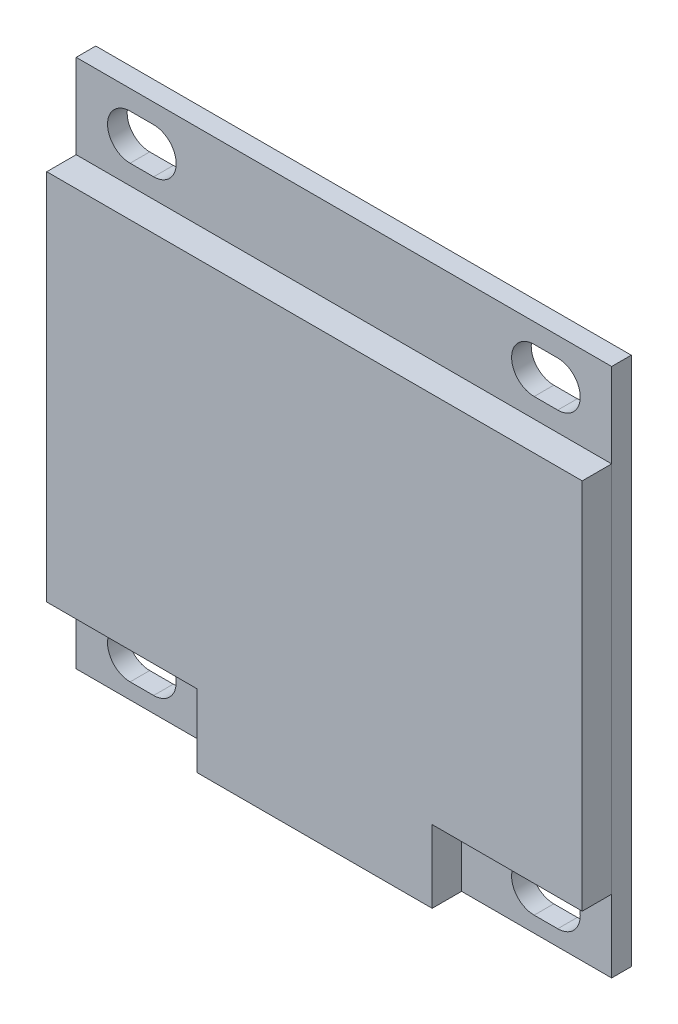
ISO-10303-21;
HEADER;
FILE_DESCRIPTION(('STEP AP214'),'2;1');
FILE_NAME('part.step','',(''),(''),'','','');
FILE_SCHEMA(('AUTOMOTIVE_DESIGN { 1 0 10303 214 1 1 1 1 }'));
ENDSEC;
DATA;
#1=APPLICATION_CONTEXT('core data for automotive mechanical design processes');
#2=APPLICATION_PROTOCOL_DEFINITION('international standard','automotive_design',2000,#1);
#3=PRODUCT_CONTEXT('',#1,'mechanical');
#4=PRODUCT('Part','Part','',(#3));
#5=PRODUCT_RELATED_PRODUCT_CATEGORY('part','',(#4));
#6=PRODUCT_DEFINITION_FORMATION('','',#4);
#7=PRODUCT_DEFINITION_CONTEXT('part definition',#1,'design');
#8=PRODUCT_DEFINITION('design','',#6,#7);
#9=PRODUCT_DEFINITION_SHAPE('','',#8);
#10=(LENGTH_UNIT() NAMED_UNIT(*) SI_UNIT(.MILLI.,.METRE.));
#11=(NAMED_UNIT(*) PLANE_ANGLE_UNIT() SI_UNIT($,.RADIAN.));
#12=(NAMED_UNIT(*) SI_UNIT($,.STERADIAN.) SOLID_ANGLE_UNIT());
#13=UNCERTAINTY_MEASURE_WITH_UNIT(LENGTH_MEASURE(1.E-05),#10,'distance_accuracy_value','');
#14=(GEOMETRIC_REPRESENTATION_CONTEXT(3) GLOBAL_UNCERTAINTY_ASSIGNED_CONTEXT((#13)) GLOBAL_UNIT_ASSIGNED_CONTEXT((#10,
#11,#12)) REPRESENTATION_CONTEXT('',''));
#15=CARTESIAN_POINT('',(0.,0.,0.));
#16=DIRECTION('',(0.,0.,1.));
#17=DIRECTION('',(1.,0.,0.));
#18=AXIS2_PLACEMENT_3D('',#15,#16,#17);
#19=CARTESIAN_POINT('',(-13.65,-9.8,2.5));
#20=DIRECTION('',(1.,0.,0.));
#21=DIRECTION('',(0.,0.,-1.));
#22=AXIS2_PLACEMENT_3D('',#19,#20,#21);
#23=PLANE('',#22);
#24=DIRECTION('',(0.,-1.,0.));
#25=VECTOR('',#24,1.);
#26=CARTESIAN_POINT('',(-13.65,-9.8,1.));
#27=LINE('',#26,#25);
#28=CARTESIAN_POINT('',(-13.65,9.19999999999999,1.));
#29=VERTEX_POINT('',#28);
#30=CARTESIAN_POINT('',(-13.65,-9.8,1.));
#31=VERTEX_POINT('',#30);
#32=EDGE_CURVE('E141',#29,#31,#27,.T.);
#33=ORIENTED_EDGE('',*,*,#32,.T.);
#34=DIRECTION('',(0.,0.,-1.));
#35=VECTOR('',#34,1.);
#36=CARTESIAN_POINT('',(-13.65,-9.8,2.5));
#37=LINE('',#36,#35);
#38=CARTESIAN_POINT('',(-13.65,-9.8,2.5));
#39=VERTEX_POINT('',#38);
#40=EDGE_CURVE('E12',#39,#31,#37,.T.);
#41=ORIENTED_EDGE('',*,*,#40,.F.);
#42=DIRECTION('',(0.,-1.,0.));
#43=VECTOR('',#42,1.);
#44=CARTESIAN_POINT('',(-13.65,-9.8,2.5));
#45=LINE('',#44,#43);
#46=CARTESIAN_POINT('',(-13.65,9.19999999999999,2.5));
#47=VERTEX_POINT('',#46);
#48=EDGE_CURVE('E155',#47,#39,#45,.T.);
#49=ORIENTED_EDGE('',*,*,#48,.F.);
#50=DIRECTION('',(0.,0.,-1.));
#51=VECTOR('',#50,1.);
#52=CARTESIAN_POINT('',(-13.65,9.19999999999999,2.5));
#53=LINE('',#52,#51);
#54=EDGE_CURVE('E137',#47,#29,#53,.T.);
#55=ORIENTED_EDGE('',*,*,#54,.T.);
#56=EDGE_LOOP('',(#33,#41,#49,#55));
#57=FACE_BOUND('',#56,.T.);
#58=ADVANCED_FACE('F45',(#57),#23,.F.);
#59=CARTESIAN_POINT('',(-13.65,-9.8,2.5));
#60=DIRECTION('',(0.,1.,0.));
#61=DIRECTION('',(-1.,0.,0.));
#62=AXIS2_PLACEMENT_3D('',#59,#60,#61);
#63=PLANE('',#62);
#64=DIRECTION('',(1.,0.,0.));
#65=VECTOR('',#64,1.);
#66=CARTESIAN_POINT('',(-13.65,-9.8,1.));
#67=LINE('',#66,#65);
#68=CARTESIAN_POINT('',(-6.,-9.8,1.));
#69=VERTEX_POINT('',#68);
#70=EDGE_CURVE('E144',#31,#69,#67,.T.);
#71=ORIENTED_EDGE('',*,*,#70,.T.);
#72=DIRECTION('',(0.,0.,-1.));
#73=VECTOR('',#72,1.);
#74=CARTESIAN_POINT('',(-6.,-9.8,2.5));
#75=LINE('',#74,#73);
#76=CARTESIAN_POINT('',(-6.,-9.8,2.5));
#77=VERTEX_POINT('',#76);
#78=EDGE_CURVE('E53',#77,#69,#75,.T.);
#79=ORIENTED_EDGE('',*,*,#78,.F.);
#80=DIRECTION('',(1.,0.,0.));
#81=VECTOR('',#80,1.);
#82=CARTESIAN_POINT('',(-13.65,-9.8,2.5));
#83=LINE('',#82,#81);
#84=EDGE_CURVE('E104',#39,#77,#83,.T.);
#85=ORIENTED_EDGE('',*,*,#84,.F.);
#86=ORIENTED_EDGE('',*,*,#40,.T.);
#87=EDGE_LOOP('',(#71,#79,#85,#86));
#88=FACE_BOUND('',#87,.T.);
#89=ADVANCED_FACE('F190',(#88),#63,.F.);
#90=CARTESIAN_POINT('',(-6.,-9.8,2.5));
#91=DIRECTION('',(1.,0.,0.));
#92=DIRECTION('',(0.,0.,-1.));
#93=AXIS2_PLACEMENT_3D('',#90,#91,#92);
#94=PLANE('',#93);
#95=DIRECTION('',(0.,-1.,0.));
#96=VECTOR('',#95,1.);
#97=CARTESIAN_POINT('',(-6.,-9.8,1.));
#98=LINE('',#97,#96);
#99=CARTESIAN_POINT('',(-6.,-13.5,1.));
#100=VERTEX_POINT('',#99);
#101=EDGE_CURVE('E146',#69,#100,#98,.T.);
#102=ORIENTED_EDGE('',*,*,#101,.T.);
#103=DIRECTION('',(0.,0.,-1.));
#104=VECTOR('',#103,1.);
#105=CARTESIAN_POINT('',(-6.,-13.5,2.5));
#106=LINE('',#105,#104);
#107=CARTESIAN_POINT('',(-6.,-13.5,2.5));
#108=VERTEX_POINT('',#107);
#109=EDGE_CURVE('E162',#108,#100,#106,.T.);
#110=ORIENTED_EDGE('',*,*,#109,.F.);
#111=DIRECTION('',(0.,-1.,0.));
#112=VECTOR('',#111,1.);
#113=CARTESIAN_POINT('',(-6.,-9.8,2.5));
#114=LINE('',#113,#112);
#115=EDGE_CURVE('E170',#77,#108,#114,.T.);
#116=ORIENTED_EDGE('',*,*,#115,.F.);
#117=ORIENTED_EDGE('',*,*,#78,.T.);
#118=EDGE_LOOP('',(#102,#110,#116,#117));
#119=FACE_BOUND('',#118,.T.);
#120=ADVANCED_FACE('F168',(#119),#94,.F.);
#121=CARTESIAN_POINT('',(-6.,-13.5,2.5));
#122=DIRECTION('',(0.,1.,0.));
#123=DIRECTION('',(0.,0.,1.));
#124=AXIS2_PLACEMENT_3D('',#121,#122,#123);
#125=PLANE('',#124);
#126=DIRECTION('',(1.,0.,0.));
#127=VECTOR('',#126,1.);
#128=CARTESIAN_POINT('',(-6.,-13.5,1.));
#129=LINE('',#128,#127);
#130=CARTESIAN_POINT('',(6.,-13.5,1.));
#131=VERTEX_POINT('',#130);
#132=EDGE_CURVE('E148',#100,#131,#129,.T.);
#133=ORIENTED_EDGE('',*,*,#132,.T.);
#134=DIRECTION('',(0.,0.,-1.));
#135=VECTOR('',#134,1.);
#136=CARTESIAN_POINT('',(6.,-13.5,2.5));
#137=LINE('',#136,#135);
#138=CARTESIAN_POINT('',(6.,-13.5,2.5));
#139=VERTEX_POINT('',#138);
#140=EDGE_CURVE('E159',#139,#131,#137,.T.);
#141=ORIENTED_EDGE('',*,*,#140,.F.);
#142=DIRECTION('',(1.,0.,0.));
#143=VECTOR('',#142,1.);
#144=CARTESIAN_POINT('',(-6.,-13.5,2.5));
#145=LINE('',#144,#143);
#146=EDGE_CURVE('E182',#108,#139,#145,.T.);
#147=ORIENTED_EDGE('',*,*,#146,.F.);
#148=ORIENTED_EDGE('',*,*,#109,.T.);
#149=EDGE_LOOP('',(#133,#141,#147,#148));
#150=FACE_BOUND('',#149,.T.);
#151=ADVANCED_FACE('F178',(#150),#125,.F.);
#152=CARTESIAN_POINT('',(6.,-13.5,2.5));
#153=DIRECTION('',(-1.,0.,0.));
#154=DIRECTION('',(0.,0.,1.));
#155=AXIS2_PLACEMENT_3D('',#152,#153,#154);
#156=PLANE('',#155);
#157=DIRECTION('',(0.,1.,0.));
#158=VECTOR('',#157,1.);
#159=CARTESIAN_POINT('',(6.,-13.5,1.));
#160=LINE('',#159,#158);
#161=CARTESIAN_POINT('',(6.,-9.8,1.));
#162=VERTEX_POINT('',#161);
#163=EDGE_CURVE('E150',#131,#162,#160,.T.);
#164=ORIENTED_EDGE('',*,*,#163,.T.);
#165=DIRECTION('',(0.,0.,-1.));
#166=VECTOR('',#165,1.);
#167=CARTESIAN_POINT('',(6.,-9.8,2.5));
#168=LINE('',#167,#166);
#169=CARTESIAN_POINT('',(6.,-9.8,2.5));
#170=VERTEX_POINT('',#169);
#171=EDGE_CURVE('E132',#170,#162,#168,.T.);
#172=ORIENTED_EDGE('',*,*,#171,.F.);
#173=DIRECTION('',(0.,1.,0.));
#174=VECTOR('',#173,1.);
#175=CARTESIAN_POINT('',(6.,-13.5,2.5));
#176=LINE('',#175,#174);
#177=EDGE_CURVE('E123',#139,#170,#176,.T.);
#178=ORIENTED_EDGE('',*,*,#177,.F.);
#179=ORIENTED_EDGE('',*,*,#140,.T.);
#180=EDGE_LOOP('',(#164,#172,#178,#179));
#181=FACE_BOUND('',#180,.T.);
#182=ADVANCED_FACE('F181',(#181),#156,.F.);
#183=CARTESIAN_POINT('',(6.,-9.8,2.5));
#184=DIRECTION('',(0.,1.,0.));
#185=DIRECTION('',(0.,0.,1.));
#186=AXIS2_PLACEMENT_3D('',#183,#184,#185);
#187=PLANE('',#186);
#188=DIRECTION('',(1.,0.,0.));
#189=VECTOR('',#188,1.);
#190=CARTESIAN_POINT('',(6.,-9.8,1.));
#191=LINE('',#190,#189);
#192=CARTESIAN_POINT('',(13.65,-9.8,1.));
#193=VERTEX_POINT('',#192);
#194=EDGE_CURVE('E131',#162,#193,#191,.T.);
#195=ORIENTED_EDGE('',*,*,#194,.T.);
#196=DIRECTION('',(0.,0.,-1.));
#197=VECTOR('',#196,1.);
#198=CARTESIAN_POINT('',(13.65,-9.8,2.5));
#199=LINE('',#198,#197);
#200=CARTESIAN_POINT('',(13.65,-9.8,2.5));
#201=VERTEX_POINT('',#200);
#202=EDGE_CURVE('E128',#201,#193,#199,.T.);
#203=ORIENTED_EDGE('',*,*,#202,.F.);
#204=DIRECTION('',(1.,0.,0.));
#205=VECTOR('',#204,1.);
#206=CARTESIAN_POINT('',(6.,-9.8,2.5));
#207=LINE('',#206,#205);
#208=EDGE_CURVE('E117',#170,#201,#207,.T.);
#209=ORIENTED_EDGE('',*,*,#208,.F.);
#210=ORIENTED_EDGE('',*,*,#171,.T.);
#211=EDGE_LOOP('',(#195,#203,#209,#210));
#212=FACE_BOUND('',#211,.T.);
#213=ADVANCED_FACE('F129',(#212),#187,.F.);
#214=CARTESIAN_POINT('',(13.65,-9.8,2.5));
#215=DIRECTION('',(-1.,0.,0.));
#216=DIRECTION('',(0.,0.,1.));
#217=AXIS2_PLACEMENT_3D('',#214,#215,#216);
#218=PLANE('',#217);
#219=DIRECTION('',(0.,1.,0.));
#220=VECTOR('',#219,1.);
#221=CARTESIAN_POINT('',(13.65,-9.8,1.));
#222=LINE('',#221,#220);
#223=CARTESIAN_POINT('',(13.65,9.19999999999999,1.));
#224=VERTEX_POINT('',#223);
#225=EDGE_CURVE('E90',#193,#224,#222,.T.);
#226=ORIENTED_EDGE('',*,*,#225,.T.);
#227=DIRECTION('',(0.,0.,-1.));
#228=VECTOR('',#227,1.);
#229=CARTESIAN_POINT('',(13.65,9.19999999999999,2.5));
#230=LINE('',#229,#228);
#231=CARTESIAN_POINT('',(13.65,9.19999999999999,2.5));
#232=VERTEX_POINT('',#231);
#233=EDGE_CURVE('E133',#232,#224,#230,.T.);
#234=ORIENTED_EDGE('',*,*,#233,.F.);
#235=DIRECTION('',(0.,1.,0.));
#236=VECTOR('',#235,1.);
#237=CARTESIAN_POINT('',(13.65,-9.8,2.5));
#238=LINE('',#237,#236);
#239=EDGE_CURVE('E121',#201,#232,#238,.T.);
#240=ORIENTED_EDGE('',*,*,#239,.F.);
#241=ORIENTED_EDGE('',*,*,#202,.T.);
#242=EDGE_LOOP('',(#226,#234,#240,#241));
#243=FACE_BOUND('',#242,.T.);
#244=ADVANCED_FACE('F135',(#243),#218,.F.);
#245=CARTESIAN_POINT('',(-13.65,9.19999999999999,2.5));
#246=DIRECTION('',(0.,-1.,0.));
#247=DIRECTION('',(0.,0.,-1.));
#248=AXIS2_PLACEMENT_3D('',#245,#246,#247);
#249=PLANE('',#248);
#250=DIRECTION('',(-1.,0.,0.));
#251=VECTOR('',#250,1.);
#252=CARTESIAN_POINT('',(-13.65,9.19999999999999,1.));
#253=LINE('',#252,#251);
#254=EDGE_CURVE('E96',#224,#29,#253,.T.);
#255=ORIENTED_EDGE('',*,*,#254,.T.);
#256=ORIENTED_EDGE('',*,*,#54,.F.);
#257=DIRECTION('',(-1.,0.,0.));
#258=VECTOR('',#257,1.);
#259=CARTESIAN_POINT('',(-13.65,9.19999999999999,2.5));
#260=LINE('',#259,#258);
#261=EDGE_CURVE('E61',#232,#47,#260,.T.);
#262=ORIENTED_EDGE('',*,*,#261,.F.);
#263=ORIENTED_EDGE('',*,*,#233,.T.);
#264=EDGE_LOOP('',(#255,#256,#262,#263));
#265=FACE_BOUND('',#264,.T.);
#266=ADVANCED_FACE('F206',(#265),#249,.F.);
#267=CARTESIAN_POINT('',(0.,0.,2.5));
#268=DIRECTION('',(0.,0.,-1.));
#269=DIRECTION('',(-1.,0.,0.));
#270=AXIS2_PLACEMENT_3D('',#267,#268,#269);
#271=PLANE('',#270);
#272=ORIENTED_EDGE('',*,*,#48,.T.);
#273=ORIENTED_EDGE('',*,*,#84,.T.);
#274=ORIENTED_EDGE('',*,*,#115,.T.);
#275=ORIENTED_EDGE('',*,*,#146,.T.);
#276=ORIENTED_EDGE('',*,*,#177,.T.);
#277=ORIENTED_EDGE('',*,*,#208,.T.);
#278=ORIENTED_EDGE('',*,*,#239,.T.);
#279=ORIENTED_EDGE('',*,*,#261,.T.);
#280=EDGE_LOOP('',(#272,#273,#274,#275,#276,#277,#278,#279));
#281=FACE_BOUND('',#280,.T.);
#282=ADVANCED_FACE('F119',(#281),#271,.F.);
#283=CARTESIAN_POINT('',(0.,0.,1.));
#284=DIRECTION('',(0.,0.,-1.));
#285=DIRECTION('',(-1.,0.,0.));
#286=AXIS2_PLACEMENT_3D('',#283,#284,#285);
#287=PLANE('',#286);
#288=ORIENTED_EDGE('',*,*,#32,.F.);
#289=ORIENTED_EDGE('',*,*,#254,.F.);
#290=ORIENTED_EDGE('',*,*,#225,.F.);
#291=ORIENTED_EDGE('',*,*,#194,.F.);
#292=ORIENTED_EDGE('',*,*,#163,.F.);
#293=ORIENTED_EDGE('',*,*,#132,.F.);
#294=ORIENTED_EDGE('',*,*,#101,.F.);
#295=ORIENTED_EDGE('',*,*,#70,.F.);
#296=EDGE_LOOP('',(#288,#289,#290,#291,#292,#293,#294,#295));
#297=FACE_BOUND('',#296,.T.);
#298=ADVANCED_FACE('F174',(#297),#287,.T.);
#299=CLOSED_SHELL('',(#58,#89,#120,#151,#182,#213,#244,#266,#282,#298));
#300=MANIFOLD_SOLID_BREP('B2',#299);
#301=CARTESIAN_POINT('',(13.65,-13.5,1.));
#302=DIRECTION('',(-1.,0.,0.));
#303=DIRECTION('',(0.,0.,1.));
#304=AXIS2_PLACEMENT_3D('',#301,#302,#303);
#305=PLANE('',#304);
#306=DIRECTION('',(0.,1.,0.));
#307=VECTOR('',#306,1.);
#308=CARTESIAN_POINT('',(13.65,-13.5,0.));
#309=LINE('',#308,#307);
#310=CARTESIAN_POINT('',(13.65,-13.5,0.));
#311=VERTEX_POINT('',#310);
#312=CARTESIAN_POINT('',(13.65,13.5,0.));
#313=VERTEX_POINT('',#312);
#314=EDGE_CURVE('E556',#311,#313,#309,.T.);
#315=ORIENTED_EDGE('',*,*,#314,.T.);
#316=DIRECTION('',(0.,0.,-1.));
#317=VECTOR('',#316,1.);
#318=CARTESIAN_POINT('',(13.65,13.5,1.));
#319=LINE('',#318,#317);
#320=CARTESIAN_POINT('',(13.65,13.5,1.));
#321=VERTEX_POINT('',#320);
#322=EDGE_CURVE('E43',#321,#313,#319,.T.);
#323=ORIENTED_EDGE('',*,*,#322,.F.);
#324=DIRECTION('',(0.,1.,0.));
#325=VECTOR('',#324,1.);
#326=CARTESIAN_POINT('',(13.65,-13.5,1.));
#327=LINE('',#326,#325);
#328=CARTESIAN_POINT('',(13.65,-13.5,1.));
#329=VERTEX_POINT('',#328);
#330=EDGE_CURVE('E563',#329,#321,#327,.T.);
#331=ORIENTED_EDGE('',*,*,#330,.F.);
#332=DIRECTION('',(0.,0.,-1.));
#333=VECTOR('',#332,1.);
#334=CARTESIAN_POINT('',(13.65,-13.5,1.));
#335=LINE('',#334,#333);
#336=EDGE_CURVE('E573',#329,#311,#335,.T.);
#337=ORIENTED_EDGE('',*,*,#336,.T.);
#338=EDGE_LOOP('',(#315,#323,#331,#337));
#339=FACE_BOUND('',#338,.T.);
#340=ADVANCED_FACE('F291',(#339),#305,.F.);
#341=CARTESIAN_POINT('',(-13.65,13.5,1.));
#342=DIRECTION('',(0.,-1.,0.));
#343=DIRECTION('',(0.,0.,-1.));
#344=AXIS2_PLACEMENT_3D('',#341,#342,#343);
#345=PLANE('',#344);
#346=DIRECTION('',(-1.,0.,0.));
#347=VECTOR('',#346,1.);
#348=CARTESIAN_POINT('',(-13.65,13.5,0.));
#349=LINE('',#348,#347);
#350=CARTESIAN_POINT('',(-13.65,13.5,0.));
#351=VERTEX_POINT('',#350);
#352=EDGE_CURVE('E576',#313,#351,#349,.T.);
#353=ORIENTED_EDGE('',*,*,#352,.T.);
#354=DIRECTION('',(0.,0.,-1.));
#355=VECTOR('',#354,1.);
#356=CARTESIAN_POINT('',(-13.65,13.5,1.));
#357=LINE('',#356,#355);
#358=CARTESIAN_POINT('',(-13.65,13.5,1.));
#359=VERTEX_POINT('',#358);
#360=EDGE_CURVE('E298',#359,#351,#357,.T.);
#361=ORIENTED_EDGE('',*,*,#360,.F.);
#362=DIRECTION('',(-1.,0.,0.));
#363=VECTOR('',#362,1.);
#364=CARTESIAN_POINT('',(-13.65,13.5,1.));
#365=LINE('',#364,#363);
#366=EDGE_CURVE('E566',#321,#359,#365,.T.);
#367=ORIENTED_EDGE('',*,*,#366,.F.);
#368=ORIENTED_EDGE('',*,*,#322,.T.);
#369=EDGE_LOOP('',(#353,#361,#367,#368));
#370=FACE_BOUND('',#369,.T.);
#371=ADVANCED_FACE('F605',(#370),#345,.F.);
#372=CARTESIAN_POINT('',(-13.65,-13.5,1.));
#373=DIRECTION('',(1.,0.,0.));
#374=DIRECTION('',(0.,0.,-1.));
#375=AXIS2_PLACEMENT_3D('',#372,#373,#374);
#376=PLANE('',#375);
#377=DIRECTION('',(0.,-1.,0.));
#378=VECTOR('',#377,1.);
#379=CARTESIAN_POINT('',(-13.65,-13.5,0.));
#380=LINE('',#379,#378);
#381=CARTESIAN_POINT('',(-13.65,-13.5,0.));
#382=VERTEX_POINT('',#381);
#383=EDGE_CURVE('E578',#351,#382,#380,.T.);
#384=ORIENTED_EDGE('',*,*,#383,.T.);
#385=DIRECTION('',(0.,0.,-1.));
#386=VECTOR('',#385,1.);
#387=CARTESIAN_POINT('',(-13.65,-13.5,1.));
#388=LINE('',#387,#386);
#389=CARTESIAN_POINT('',(-13.65,-13.5,1.));
#390=VERTEX_POINT('',#389);
#391=EDGE_CURVE('E583',#390,#382,#388,.T.);
#392=ORIENTED_EDGE('',*,*,#391,.F.);
#393=DIRECTION('',(0.,-1.,0.));
#394=VECTOR('',#393,1.);
#395=CARTESIAN_POINT('',(-13.65,-13.5,1.));
#396=LINE('',#395,#394);
#397=EDGE_CURVE('E569',#359,#390,#396,.T.);
#398=ORIENTED_EDGE('',*,*,#397,.F.);
#399=ORIENTED_EDGE('',*,*,#360,.T.);
#400=EDGE_LOOP('',(#384,#392,#398,#399));
#401=FACE_BOUND('',#400,.T.);
#402=ADVANCED_FACE('F590',(#401),#376,.F.);
#403=CARTESIAN_POINT('',(-13.65,-13.5,1.));
#404=DIRECTION('',(0.,1.,0.));
#405=DIRECTION('',(0.,0.,1.));
#406=AXIS2_PLACEMENT_3D('',#403,#404,#405);
#407=PLANE('',#406);
#408=DIRECTION('',(1.,0.,0.));
#409=VECTOR('',#408,1.);
#410=CARTESIAN_POINT('',(-13.65,-13.5,0.));
#411=LINE('',#410,#409);
#412=EDGE_CURVE('E567',#382,#311,#411,.T.);
#413=ORIENTED_EDGE('',*,*,#412,.T.);
#414=ORIENTED_EDGE('',*,*,#336,.F.);
#415=DIRECTION('',(1.,0.,0.));
#416=VECTOR('',#415,1.);
#417=CARTESIAN_POINT('',(-13.65,-13.5,1.));
#418=LINE('',#417,#416);
#419=EDGE_CURVE('E571',#390,#329,#418,.T.);
#420=ORIENTED_EDGE('',*,*,#419,.F.);
#421=ORIENTED_EDGE('',*,*,#391,.T.);
#422=EDGE_LOOP('',(#413,#414,#420,#421));
#423=FACE_BOUND('',#422,.T.);
#424=ADVANCED_FACE('F598',(#423),#407,.F.);
#425=CARTESIAN_POINT('',(0.,0.,1.));
#426=DIRECTION('',(0.,0.,-1.));
#427=DIRECTION('',(-1.,0.,0.));
#428=AXIS2_PLACEMENT_3D('',#425,#426,#427);
#429=PLANE('',#428);
#430=DIRECTION('',(-1.,0.,0.));
#431=VECTOR('',#430,1.);
#432=CARTESIAN_POINT('',(10.9,12.5,1.));
#433=LINE('',#432,#431);
#434=CARTESIAN_POINT('',(10.9,12.5,1.));
#435=VERTEX_POINT('',#434);
#436=CARTESIAN_POINT('',(9.7,12.5,1.));
#437=VERTEX_POINT('',#436);
#438=EDGE_CURVE('E485',#435,#437,#433,.T.);
#439=ORIENTED_EDGE('',*,*,#438,.F.);
#440=CARTESIAN_POINT('',(10.9,11.35,1.));
#441=DIRECTION('',(0.,0.,1.));
#442=DIRECTION('',(-1.,0.,0.));
#443=AXIS2_PLACEMENT_3D('',#440,#441,#442);
#444=CIRCLE('',#443,1.15);
#445=CARTESIAN_POINT('',(10.9,10.2,1.));
#446=VERTEX_POINT('',#445);
#447=EDGE_CURVE('E305',#446,#435,#444,.T.);
#448=ORIENTED_EDGE('',*,*,#447,.F.);
#449=DIRECTION('',(1.,0.,0.));
#450=VECTOR('',#449,1.);
#451=CARTESIAN_POINT('',(10.9,10.2,1.));
#452=LINE('',#451,#450);
#453=CARTESIAN_POINT('',(9.7,10.2,1.));
#454=VERTEX_POINT('',#453);
#455=EDGE_CURVE('E474',#454,#446,#452,.T.);
#456=ORIENTED_EDGE('',*,*,#455,.F.);
#457=CARTESIAN_POINT('',(9.7,11.35,1.));
#458=DIRECTION('',(0.,0.,1.));
#459=DIRECTION('',(-1.,0.,0.));
#460=AXIS2_PLACEMENT_3D('',#457,#458,#459);
#461=CIRCLE('',#460,1.15);
#462=EDGE_CURVE('E489',#437,#454,#461,.T.);
#463=ORIENTED_EDGE('',*,*,#462,.F.);
#464=EDGE_LOOP('',(#439,#448,#456,#463));
#465=FACE_BOUND('',#464,.T.);
#466=DIRECTION('',(1.,0.,0.));
#467=VECTOR('',#466,1.);
#468=CARTESIAN_POINT('',(-10.9,-12.7,1.));
#469=LINE('',#468,#467);
#470=CARTESIAN_POINT('',(-10.9,-12.7,1.));
#471=VERTEX_POINT('',#470);
#472=CARTESIAN_POINT('',(-9.7,-12.7,1.));
#473=VERTEX_POINT('',#472);
#474=EDGE_CURVE('E517',#471,#473,#469,.T.);
#475=ORIENTED_EDGE('',*,*,#474,.F.);
#476=CARTESIAN_POINT('',(-10.9,-11.55,1.));
#477=DIRECTION('',(0.,0.,1.));
#478=DIRECTION('',(1.,0.,0.));
#479=AXIS2_PLACEMENT_3D('',#476,#477,#478);
#480=CIRCLE('',#479,1.15);
#481=CARTESIAN_POINT('',(-10.9,-10.4,1.));
#482=VERTEX_POINT('',#481);
#483=EDGE_CURVE('E313',#482,#471,#480,.T.);
#484=ORIENTED_EDGE('',*,*,#483,.F.);
#485=DIRECTION('',(-1.,0.,0.));
#486=VECTOR('',#485,1.);
#487=CARTESIAN_POINT('',(-10.9,-10.4,1.));
#488=LINE('',#487,#486);
#489=CARTESIAN_POINT('',(-9.7,-10.4,1.));
#490=VERTEX_POINT('',#489);
#491=EDGE_CURVE('E506',#490,#482,#488,.T.);
#492=ORIENTED_EDGE('',*,*,#491,.F.);
#493=CARTESIAN_POINT('',(-9.7,-11.55,1.));
#494=DIRECTION('',(0.,0.,1.));
#495=DIRECTION('',(1.,0.,0.));
#496=AXIS2_PLACEMENT_3D('',#493,#494,#495);
#497=CIRCLE('',#496,1.15);
#498=EDGE_CURVE('E520',#473,#490,#497,.T.);
#499=ORIENTED_EDGE('',*,*,#498,.F.);
#500=EDGE_LOOP('',(#475,#484,#492,#499));
#501=FACE_BOUND('',#500,.T.);
#502=DIRECTION('',(-1.,0.,0.));
#503=VECTOR('',#502,1.);
#504=CARTESIAN_POINT('',(10.9,-10.4,1.));
#505=LINE('',#504,#503);
#506=CARTESIAN_POINT('',(10.9,-10.4,1.));
#507=VERTEX_POINT('',#506);
#508=CARTESIAN_POINT('',(9.7,-10.4,1.));
#509=VERTEX_POINT('',#508);
#510=EDGE_CURVE('E461',#507,#509,#505,.T.);
#511=ORIENTED_EDGE('',*,*,#510,.F.);
#512=CARTESIAN_POINT('',(10.9,-11.55,1.));
#513=DIRECTION('',(0.,0.,1.));
#514=DIRECTION('',(-1.,0.,0.));
#515=AXIS2_PLACEMENT_3D('',#512,#513,#514);
#516=CIRCLE('',#515,1.15);
#517=CARTESIAN_POINT('',(10.9,-12.7,1.));
#518=VERTEX_POINT('',#517);
#519=EDGE_CURVE('E434',#518,#507,#516,.T.);
#520=ORIENTED_EDGE('',*,*,#519,.F.);
#521=DIRECTION('',(1.,0.,0.));
#522=VECTOR('',#521,1.);
#523=CARTESIAN_POINT('',(10.9,-12.7,1.));
#524=LINE('',#523,#522);
#525=CARTESIAN_POINT('',(9.7,-12.7,1.));
#526=VERTEX_POINT('',#525);
#527=EDGE_CURVE('E452',#526,#518,#524,.T.);
#528=ORIENTED_EDGE('',*,*,#527,.F.);
#529=CARTESIAN_POINT('',(9.7,-11.55,1.));
#530=DIRECTION('',(0.,0.,1.));
#531=DIRECTION('',(-1.,0.,0.));
#532=AXIS2_PLACEMENT_3D('',#529,#530,#531);
#533=CIRCLE('',#532,1.15);
#534=EDGE_CURVE('E455',#509,#526,#533,.T.);
#535=ORIENTED_EDGE('',*,*,#534,.F.);
#536=EDGE_LOOP('',(#511,#520,#528,#535));
#537=FACE_BOUND('',#536,.T.);
#538=DIRECTION('',(1.,0.,0.));
#539=VECTOR('',#538,1.);
#540=CARTESIAN_POINT('',(-10.9,10.2,1.));
#541=LINE('',#540,#539);
#542=CARTESIAN_POINT('',(-10.9,10.2,1.));
#543=VERTEX_POINT('',#542);
#544=CARTESIAN_POINT('',(-9.7,10.2,1.));
#545=VERTEX_POINT('',#544);
#546=EDGE_CURVE('E546',#543,#545,#541,.T.);
#547=ORIENTED_EDGE('',*,*,#546,.F.);
#548=CARTESIAN_POINT('',(-10.9,11.35,1.));
#549=DIRECTION('',(0.,0.,1.));
#550=DIRECTION('',(1.,0.,0.));
#551=AXIS2_PLACEMENT_3D('',#548,#549,#550);
#552=CIRCLE('',#551,1.15);
#553=CARTESIAN_POINT('',(-10.9,12.5,1.));
#554=VERTEX_POINT('',#553);
#555=EDGE_CURVE('E496',#554,#543,#552,.T.);
#556=ORIENTED_EDGE('',*,*,#555,.F.);
#557=DIRECTION('',(-1.,0.,0.));
#558=VECTOR('',#557,1.);
#559=CARTESIAN_POINT('',(-10.9,12.5,1.));
#560=LINE('',#559,#558);
#561=CARTESIAN_POINT('',(-9.7,12.5,1.));
#562=VERTEX_POINT('',#561);
#563=EDGE_CURVE('E535',#562,#554,#560,.T.);
#564=ORIENTED_EDGE('',*,*,#563,.F.);
#565=CARTESIAN_POINT('',(-9.7,11.35,1.));
#566=DIRECTION('',(0.,0.,1.));
#567=DIRECTION('',(1.,0.,0.));
#568=AXIS2_PLACEMENT_3D('',#565,#566,#567);
#569=CIRCLE('',#568,1.15);
#570=EDGE_CURVE('E549',#545,#562,#569,.T.);
#571=ORIENTED_EDGE('',*,*,#570,.F.);
#572=EDGE_LOOP('',(#547,#556,#564,#571));
#573=FACE_BOUND('',#572,.T.);
#574=ORIENTED_EDGE('',*,*,#330,.T.);
#575=ORIENTED_EDGE('',*,*,#366,.T.);
#576=ORIENTED_EDGE('',*,*,#397,.T.);
#577=ORIENTED_EDGE('',*,*,#419,.T.);
#578=EDGE_LOOP('',(#574,#575,#576,#577));
#579=FACE_BOUND('',#578,.T.);
#580=ADVANCED_FACE('F604',(#465,#501,#537,#573,#579),#429,.F.);
#581=CARTESIAN_POINT('',(0.,0.,0.));
#582=DIRECTION('',(0.,0.,-1.));
#583=DIRECTION('',(-1.,0.,0.));
#584=AXIS2_PLACEMENT_3D('',#581,#582,#583);
#585=PLANE('',#584);
#586=CARTESIAN_POINT('',(10.9,11.35,0.));
#587=DIRECTION('',(0.,0.,1.));
#588=DIRECTION('',(-1.,0.,0.));
#589=AXIS2_PLACEMENT_3D('',#586,#587,#588);
#590=CIRCLE('',#589,1.15);
#591=CARTESIAN_POINT('',(10.9,10.2,0.));
#592=VERTEX_POINT('',#591);
#593=CARTESIAN_POINT('',(10.9,12.5,0.));
#594=VERTEX_POINT('',#593);
#595=EDGE_CURVE('E470',#592,#594,#590,.T.);
#596=ORIENTED_EDGE('',*,*,#595,.T.);
#597=DIRECTION('',(-1.,0.,0.));
#598=VECTOR('',#597,1.);
#599=CARTESIAN_POINT('',(10.9,12.5,0.));
#600=LINE('',#599,#598);
#601=CARTESIAN_POINT('',(9.7,12.5,0.));
#602=VERTEX_POINT('',#601);
#603=EDGE_CURVE('E473',#594,#602,#600,.T.);
#604=ORIENTED_EDGE('',*,*,#603,.T.);
#605=CARTESIAN_POINT('',(9.7,11.35,0.));
#606=DIRECTION('',(0.,0.,1.));
#607=DIRECTION('',(-1.,0.,0.));
#608=AXIS2_PLACEMENT_3D('',#605,#606,#607);
#609=CIRCLE('',#608,1.15);
#610=CARTESIAN_POINT('',(9.7,10.2,0.));
#611=VERTEX_POINT('',#610);
#612=EDGE_CURVE('E477',#602,#611,#609,.T.);
#613=ORIENTED_EDGE('',*,*,#612,.T.);
#614=DIRECTION('',(1.,0.,0.));
#615=VECTOR('',#614,1.);
#616=CARTESIAN_POINT('',(10.9,10.2,0.));
#617=LINE('',#616,#615);
#618=EDGE_CURVE('E480',#611,#592,#617,.T.);
#619=ORIENTED_EDGE('',*,*,#618,.T.);
#620=EDGE_LOOP('',(#596,#604,#613,#619));
#621=FACE_BOUND('',#620,.T.);
#622=CARTESIAN_POINT('',(-10.9,-11.55,0.));
#623=DIRECTION('',(0.,0.,1.));
#624=DIRECTION('',(1.,0.,0.));
#625=AXIS2_PLACEMENT_3D('',#622,#623,#624);
#626=CIRCLE('',#625,1.15);
#627=CARTESIAN_POINT('',(-10.9,-10.4,0.));
#628=VERTEX_POINT('',#627);
#629=CARTESIAN_POINT('',(-10.9,-12.7,0.));
#630=VERTEX_POINT('',#629);
#631=EDGE_CURVE('E502',#628,#630,#626,.T.);
#632=ORIENTED_EDGE('',*,*,#631,.T.);
#633=DIRECTION('',(1.,0.,0.));
#634=VECTOR('',#633,1.);
#635=CARTESIAN_POINT('',(-10.9,-12.7,0.));
#636=LINE('',#635,#634);
#637=CARTESIAN_POINT('',(-9.7,-12.7,0.));
#638=VERTEX_POINT('',#637);
#639=EDGE_CURVE('E505',#630,#638,#636,.T.);
#640=ORIENTED_EDGE('',*,*,#639,.T.);
#641=CARTESIAN_POINT('',(-9.7,-11.55,0.));
#642=DIRECTION('',(0.,0.,1.));
#643=DIRECTION('',(1.,0.,0.));
#644=AXIS2_PLACEMENT_3D('',#641,#642,#643);
#645=CIRCLE('',#644,1.15);
#646=CARTESIAN_POINT('',(-9.7,-10.4,0.));
#647=VERTEX_POINT('',#646);
#648=EDGE_CURVE('E509',#638,#647,#645,.T.);
#649=ORIENTED_EDGE('',*,*,#648,.T.);
#650=DIRECTION('',(-1.,0.,0.));
#651=VECTOR('',#650,1.);
#652=CARTESIAN_POINT('',(-10.9,-10.4,0.));
#653=LINE('',#652,#651);
#654=EDGE_CURVE('E512',#647,#628,#653,.T.);
#655=ORIENTED_EDGE('',*,*,#654,.T.);
#656=EDGE_LOOP('',(#632,#640,#649,#655));
#657=FACE_BOUND('',#656,.T.);
#658=CARTESIAN_POINT('',(10.9,-11.55,0.));
#659=DIRECTION('',(0.,0.,1.));
#660=DIRECTION('',(-1.,0.,0.));
#661=AXIS2_PLACEMENT_3D('',#658,#659,#660);
#662=CIRCLE('',#661,1.15);
#663=CARTESIAN_POINT('',(10.9,-12.7,0.));
#664=VERTEX_POINT('',#663);
#665=CARTESIAN_POINT('',(10.9,-10.4,0.));
#666=VERTEX_POINT('',#665);
#667=EDGE_CURVE('E431',#664,#666,#662,.T.);
#668=ORIENTED_EDGE('',*,*,#667,.T.);
#669=DIRECTION('',(-1.,0.,0.));
#670=VECTOR('',#669,1.);
#671=CARTESIAN_POINT('',(10.9,-10.4,0.));
#672=LINE('',#671,#670);
#673=CARTESIAN_POINT('',(9.7,-10.4,0.));
#674=VERTEX_POINT('',#673);
#675=EDGE_CURVE('E443',#666,#674,#672,.T.);
#676=ORIENTED_EDGE('',*,*,#675,.T.);
#677=CARTESIAN_POINT('',(9.7,-11.55,0.));
#678=DIRECTION('',(0.,0.,1.));
#679=DIRECTION('',(-1.,0.,0.));
#680=AXIS2_PLACEMENT_3D('',#677,#678,#679);
#681=CIRCLE('',#680,1.15);
#682=CARTESIAN_POINT('',(9.7,-12.7,0.));
#683=VERTEX_POINT('',#682);
#684=EDGE_CURVE('E447',#674,#683,#681,.T.);
#685=ORIENTED_EDGE('',*,*,#684,.T.);
#686=DIRECTION('',(1.,0.,0.));
#687=VECTOR('',#686,1.);
#688=CARTESIAN_POINT('',(10.9,-12.7,0.));
#689=LINE('',#688,#687);
#690=EDGE_CURVE('E439',#683,#664,#689,.T.);
#691=ORIENTED_EDGE('',*,*,#690,.T.);
#692=EDGE_LOOP('',(#668,#676,#685,#691));
#693=FACE_BOUND('',#692,.T.);
#694=CARTESIAN_POINT('',(-10.9,11.35,0.));
#695=DIRECTION('',(0.,0.,1.));
#696=DIRECTION('',(1.,0.,0.));
#697=AXIS2_PLACEMENT_3D('',#694,#695,#696);
#698=CIRCLE('',#697,1.15);
#699=CARTESIAN_POINT('',(-10.9,12.5,0.));
#700=VERTEX_POINT('',#699);
#701=CARTESIAN_POINT('',(-10.9,10.2,0.));
#702=VERTEX_POINT('',#701);
#703=EDGE_CURVE('E531',#700,#702,#698,.T.);
#704=ORIENTED_EDGE('',*,*,#703,.T.);
#705=DIRECTION('',(1.,0.,0.));
#706=VECTOR('',#705,1.);
#707=CARTESIAN_POINT('',(-10.9,10.2,0.));
#708=LINE('',#707,#706);
#709=CARTESIAN_POINT('',(-9.7,10.2,0.));
#710=VERTEX_POINT('',#709);
#711=EDGE_CURVE('E534',#702,#710,#708,.T.);
#712=ORIENTED_EDGE('',*,*,#711,.T.);
#713=CARTESIAN_POINT('',(-9.7,11.35,0.));
#714=DIRECTION('',(0.,0.,1.));
#715=DIRECTION('',(1.,0.,0.));
#716=AXIS2_PLACEMENT_3D('',#713,#714,#715);
#717=CIRCLE('',#716,1.15);
#718=CARTESIAN_POINT('',(-9.7,12.5,0.));
#719=VERTEX_POINT('',#718);
#720=EDGE_CURVE('E538',#710,#719,#717,.T.);
#721=ORIENTED_EDGE('',*,*,#720,.T.);
#722=DIRECTION('',(-1.,0.,0.));
#723=VECTOR('',#722,1.);
#724=CARTESIAN_POINT('',(-10.9,12.5,0.));
#725=LINE('',#724,#723);
#726=EDGE_CURVE('E541',#719,#700,#725,.T.);
#727=ORIENTED_EDGE('',*,*,#726,.T.);
#728=EDGE_LOOP('',(#704,#712,#721,#727));
#729=FACE_BOUND('',#728,.T.);
#730=ORIENTED_EDGE('',*,*,#314,.F.);
#731=ORIENTED_EDGE('',*,*,#412,.F.);
#732=ORIENTED_EDGE('',*,*,#383,.F.);
#733=ORIENTED_EDGE('',*,*,#352,.F.);
#734=EDGE_LOOP('',(#730,#731,#732,#733));
#735=FACE_BOUND('',#734,.T.);
#736=ADVANCED_FACE('F449',(#621,#657,#693,#729,#735),#585,.T.);
#737=CARTESIAN_POINT('',(-10.9,11.35,0.));
#738=DIRECTION('',(0.,0.,1.));
#739=DIRECTION('',(1.,0.,0.));
#740=AXIS2_PLACEMENT_3D('',#737,#738,#739);
#741=CYLINDRICAL_SURFACE('',#740,1.15);
#742=ORIENTED_EDGE('',*,*,#555,.T.);
#743=DIRECTION('',(0.,0.,1.));
#744=VECTOR('',#743,1.);
#745=CARTESIAN_POINT('',(-10.9,10.2,0.));
#746=LINE('',#745,#744);
#747=EDGE_CURVE('E544',#702,#543,#746,.T.);
#748=ORIENTED_EDGE('',*,*,#747,.F.);
#749=ORIENTED_EDGE('',*,*,#703,.F.);
#750=DIRECTION('',(0.,0.,1.));
#751=VECTOR('',#750,1.);
#752=CARTESIAN_POINT('',(-10.9,12.5,0.));
#753=LINE('',#752,#751);
#754=EDGE_CURVE('E554',#700,#554,#753,.T.);
#755=ORIENTED_EDGE('',*,*,#754,.T.);
#756=EDGE_LOOP('',(#742,#748,#749,#755));
#757=FACE_BOUND('',#756,.T.);
#758=ADVANCED_FACE('F617',(#757),#741,.F.);
#759=CARTESIAN_POINT('',(-10.9,12.5,0.));
#760=DIRECTION('',(0.,1.,0.));
#761=DIRECTION('',(0.,0.,1.));
#762=AXIS2_PLACEMENT_3D('',#759,#760,#761);
#763=PLANE('',#762);
#764=ORIENTED_EDGE('',*,*,#563,.T.);
#765=ORIENTED_EDGE('',*,*,#754,.F.);
#766=ORIENTED_EDGE('',*,*,#726,.F.);
#767=DIRECTION('',(0.,0.,1.));
#768=VECTOR('',#767,1.);
#769=CARTESIAN_POINT('',(-9.7,12.5,0.));
#770=LINE('',#769,#768);
#771=EDGE_CURVE('E557',#719,#562,#770,.T.);
#772=ORIENTED_EDGE('',*,*,#771,.T.);
#773=EDGE_LOOP('',(#764,#765,#766,#772));
#774=FACE_BOUND('',#773,.T.);
#775=ADVANCED_FACE('F624',(#774),#763,.F.);
#776=CARTESIAN_POINT('',(-9.7,11.35,0.));
#777=DIRECTION('',(0.,0.,1.));
#778=DIRECTION('',(1.,0.,0.));
#779=AXIS2_PLACEMENT_3D('',#776,#777,#778);
#780=CYLINDRICAL_SURFACE('',#779,1.15);
#781=ORIENTED_EDGE('',*,*,#570,.T.);
#782=ORIENTED_EDGE('',*,*,#771,.F.);
#783=ORIENTED_EDGE('',*,*,#720,.F.);
#784=DIRECTION('',(0.,0.,1.));
#785=VECTOR('',#784,1.);
#786=CARTESIAN_POINT('',(-9.7,10.2,0.));
#787=LINE('',#786,#785);
#788=EDGE_CURVE('E559',#710,#545,#787,.T.);
#789=ORIENTED_EDGE('',*,*,#788,.T.);
#790=EDGE_LOOP('',(#781,#782,#783,#789));
#791=FACE_BOUND('',#790,.T.);
#792=ADVANCED_FACE('F629',(#791),#780,.F.);
#793=CARTESIAN_POINT('',(-10.9,10.2,0.));
#794=DIRECTION('',(0.,-1.,0.));
#795=DIRECTION('',(0.,0.,-1.));
#796=AXIS2_PLACEMENT_3D('',#793,#794,#795);
#797=PLANE('',#796);
#798=ORIENTED_EDGE('',*,*,#546,.T.);
#799=ORIENTED_EDGE('',*,*,#788,.F.);
#800=ORIENTED_EDGE('',*,*,#711,.F.);
#801=ORIENTED_EDGE('',*,*,#747,.T.);
#802=EDGE_LOOP('',(#798,#799,#800,#801));
#803=FACE_BOUND('',#802,.T.);
#804=ADVANCED_FACE('F626',(#803),#797,.F.);
#805=CARTESIAN_POINT('',(10.9,-11.55,0.));
#806=DIRECTION('',(0.,0.,1.));
#807=DIRECTION('',(1.,0.,0.));
#808=AXIS2_PLACEMENT_3D('',#805,#806,#807);
#809=CYLINDRICAL_SURFACE('',#808,1.15);
#810=ORIENTED_EDGE('',*,*,#519,.T.);
#811=DIRECTION('',(0.,0.,1.));
#812=VECTOR('',#811,1.);
#813=CARTESIAN_POINT('',(10.9,-10.4,0.));
#814=LINE('',#813,#812);
#815=EDGE_CURVE('E427',#666,#507,#814,.T.);
#816=ORIENTED_EDGE('',*,*,#815,.F.);
#817=ORIENTED_EDGE('',*,*,#667,.F.);
#818=DIRECTION('',(0.,0.,1.));
#819=VECTOR('',#818,1.);
#820=CARTESIAN_POINT('',(10.9,-12.7,0.));
#821=LINE('',#820,#819);
#822=EDGE_CURVE('E465',#664,#518,#821,.T.);
#823=ORIENTED_EDGE('',*,*,#822,.T.);
#824=EDGE_LOOP('',(#810,#816,#817,#823));
#825=FACE_BOUND('',#824,.T.);
#826=ADVANCED_FACE('F429',(#825),#809,.F.);
#827=CARTESIAN_POINT('',(10.9,-12.7,0.));
#828=DIRECTION('',(0.,-1.,0.));
#829=DIRECTION('',(1.,0.,0.));
#830=AXIS2_PLACEMENT_3D('',#827,#828,#829);
#831=PLANE('',#830);
#832=ORIENTED_EDGE('',*,*,#527,.T.);
#833=ORIENTED_EDGE('',*,*,#822,.F.);
#834=ORIENTED_EDGE('',*,*,#690,.F.);
#835=DIRECTION('',(0.,0.,1.));
#836=VECTOR('',#835,1.);
#837=CARTESIAN_POINT('',(9.7,-12.7,0.));
#838=LINE('',#837,#836);
#839=EDGE_CURVE('E467',#683,#526,#838,.T.);
#840=ORIENTED_EDGE('',*,*,#839,.T.);
#841=EDGE_LOOP('',(#832,#833,#834,#840));
#842=FACE_BOUND('',#841,.T.);
#843=ADVANCED_FACE('F669',(#842),#831,.F.);
#844=CARTESIAN_POINT('',(9.7,-11.55,0.));
#845=DIRECTION('',(0.,0.,1.));
#846=DIRECTION('',(1.,0.,0.));
#847=AXIS2_PLACEMENT_3D('',#844,#845,#846);
#848=CYLINDRICAL_SURFACE('',#847,1.15);
#849=ORIENTED_EDGE('',*,*,#534,.T.);
#850=ORIENTED_EDGE('',*,*,#839,.F.);
#851=ORIENTED_EDGE('',*,*,#684,.F.);
#852=DIRECTION('',(0.,0.,1.));
#853=VECTOR('',#852,1.);
#854=CARTESIAN_POINT('',(9.7,-10.4,0.));
#855=LINE('',#854,#853);
#856=EDGE_CURVE('E438',#674,#509,#855,.T.);
#857=ORIENTED_EDGE('',*,*,#856,.T.);
#858=EDGE_LOOP('',(#849,#850,#851,#857));
#859=FACE_BOUND('',#858,.T.);
#860=ADVANCED_FACE('F672',(#859),#848,.F.);
#861=CARTESIAN_POINT('',(10.9,-10.4,0.));
#862=DIRECTION('',(0.,1.,0.));
#863=DIRECTION('',(-1.,0.,0.));
#864=AXIS2_PLACEMENT_3D('',#861,#862,#863);
#865=PLANE('',#864);
#866=ORIENTED_EDGE('',*,*,#510,.T.);
#867=ORIENTED_EDGE('',*,*,#856,.F.);
#868=ORIENTED_EDGE('',*,*,#675,.F.);
#869=ORIENTED_EDGE('',*,*,#815,.T.);
#870=EDGE_LOOP('',(#866,#867,#868,#869));
#871=FACE_BOUND('',#870,.T.);
#872=ADVANCED_FACE('F444',(#871),#865,.F.);
#873=CARTESIAN_POINT('',(-10.9,-11.55,0.));
#874=DIRECTION('',(0.,0.,1.));
#875=DIRECTION('',(1.,0.,0.));
#876=AXIS2_PLACEMENT_3D('',#873,#874,#875);
#877=CYLINDRICAL_SURFACE('',#876,1.15);
#878=ORIENTED_EDGE('',*,*,#483,.T.);
#879=DIRECTION('',(0.,0.,1.));
#880=VECTOR('',#879,1.);
#881=CARTESIAN_POINT('',(-10.9,-12.7,0.));
#882=LINE('',#881,#880);
#883=EDGE_CURVE('E515',#630,#471,#882,.T.);
#884=ORIENTED_EDGE('',*,*,#883,.F.);
#885=ORIENTED_EDGE('',*,*,#631,.F.);
#886=DIRECTION('',(0.,0.,1.));
#887=VECTOR('',#886,1.);
#888=CARTESIAN_POINT('',(-10.9,-10.4,0.));
#889=LINE('',#888,#887);
#890=EDGE_CURVE('E486',#628,#482,#889,.T.);
#891=ORIENTED_EDGE('',*,*,#890,.T.);
#892=EDGE_LOOP('',(#878,#884,#885,#891));
#893=FACE_BOUND('',#892,.T.);
#894=ADVANCED_FACE('F637',(#893),#877,.F.);
#895=CARTESIAN_POINT('',(-10.9,-10.4,0.));
#896=DIRECTION('',(0.,1.,0.));
#897=DIRECTION('',(-1.,0.,0.));
#898=AXIS2_PLACEMENT_3D('',#895,#896,#897);
#899=PLANE('',#898);
#900=ORIENTED_EDGE('',*,*,#491,.T.);
#901=ORIENTED_EDGE('',*,*,#890,.F.);
#902=ORIENTED_EDGE('',*,*,#654,.F.);
#903=DIRECTION('',(0.,0.,1.));
#904=VECTOR('',#903,1.);
#905=CARTESIAN_POINT('',(-9.7,-10.4,0.));
#906=LINE('',#905,#904);
#907=EDGE_CURVE('E526',#647,#490,#906,.T.);
#908=ORIENTED_EDGE('',*,*,#907,.T.);
#909=EDGE_LOOP('',(#900,#901,#902,#908));
#910=FACE_BOUND('',#909,.T.);
#911=ADVANCED_FACE('F640',(#910),#899,.F.);
#912=CARTESIAN_POINT('',(-9.7,-11.55,0.));
#913=DIRECTION('',(0.,0.,1.));
#914=DIRECTION('',(1.,0.,0.));
#915=AXIS2_PLACEMENT_3D('',#912,#913,#914);
#916=CYLINDRICAL_SURFACE('',#915,1.15);
#917=ORIENTED_EDGE('',*,*,#498,.T.);
#918=ORIENTED_EDGE('',*,*,#907,.F.);
#919=ORIENTED_EDGE('',*,*,#648,.F.);
#920=DIRECTION('',(0.,0.,1.));
#921=VECTOR('',#920,1.);
#922=CARTESIAN_POINT('',(-9.7,-12.7,0.));
#923=LINE('',#922,#921);
#924=EDGE_CURVE('E528',#638,#473,#923,.T.);
#925=ORIENTED_EDGE('',*,*,#924,.T.);
#926=EDGE_LOOP('',(#917,#918,#919,#925));
#927=FACE_BOUND('',#926,.T.);
#928=ADVANCED_FACE('F645',(#927),#916,.F.);
#929=CARTESIAN_POINT('',(-10.9,-12.7,0.));
#930=DIRECTION('',(0.,-1.,0.));
#931=DIRECTION('',(1.,0.,0.));
#932=AXIS2_PLACEMENT_3D('',#929,#930,#931);
#933=PLANE('',#932);
#934=ORIENTED_EDGE('',*,*,#474,.T.);
#935=ORIENTED_EDGE('',*,*,#924,.F.);
#936=ORIENTED_EDGE('',*,*,#639,.F.);
#937=ORIENTED_EDGE('',*,*,#883,.T.);
#938=EDGE_LOOP('',(#934,#935,#936,#937));
#939=FACE_BOUND('',#938,.T.);
#940=ADVANCED_FACE('F641',(#939),#933,.F.);
#941=CARTESIAN_POINT('',(10.9,11.35,0.));
#942=DIRECTION('',(0.,0.,1.));
#943=DIRECTION('',(1.,0.,0.));
#944=AXIS2_PLACEMENT_3D('',#941,#942,#943);
#945=CYLINDRICAL_SURFACE('',#944,1.15);
#946=ORIENTED_EDGE('',*,*,#447,.T.);
#947=DIRECTION('',(0.,0.,1.));
#948=VECTOR('',#947,1.);
#949=CARTESIAN_POINT('',(10.9,12.5,0.));
#950=LINE('',#949,#948);
#951=EDGE_CURVE('E483',#594,#435,#950,.T.);
#952=ORIENTED_EDGE('',*,*,#951,.F.);
#953=ORIENTED_EDGE('',*,*,#595,.F.);
#954=DIRECTION('',(0.,0.,1.));
#955=VECTOR('',#954,1.);
#956=CARTESIAN_POINT('',(10.9,10.2,0.));
#957=LINE('',#956,#955);
#958=EDGE_CURVE('E494',#592,#446,#957,.T.);
#959=ORIENTED_EDGE('',*,*,#958,.T.);
#960=EDGE_LOOP('',(#946,#952,#953,#959));
#961=FACE_BOUND('',#960,.T.);
#962=ADVANCED_FACE('F644',(#961),#945,.F.);
#963=CARTESIAN_POINT('',(10.9,10.2,0.));
#964=DIRECTION('',(0.,-1.,0.));
#965=DIRECTION('',(0.,0.,-1.));
#966=AXIS2_PLACEMENT_3D('',#963,#964,#965);
#967=PLANE('',#966);
#968=ORIENTED_EDGE('',*,*,#455,.T.);
#969=ORIENTED_EDGE('',*,*,#958,.F.);
#970=ORIENTED_EDGE('',*,*,#618,.F.);
#971=DIRECTION('',(0.,0.,1.));
#972=VECTOR('',#971,1.);
#973=CARTESIAN_POINT('',(9.7,10.2,0.));
#974=LINE('',#973,#972);
#975=EDGE_CURVE('E497',#611,#454,#974,.T.);
#976=ORIENTED_EDGE('',*,*,#975,.T.);
#977=EDGE_LOOP('',(#968,#969,#970,#976));
#978=FACE_BOUND('',#977,.T.);
#979=ADVANCED_FACE('F655',(#978),#967,.F.);
#980=CARTESIAN_POINT('',(9.7,11.35,0.));
#981=DIRECTION('',(0.,0.,1.));
#982=DIRECTION('',(1.,0.,0.));
#983=AXIS2_PLACEMENT_3D('',#980,#981,#982);
#984=CYLINDRICAL_SURFACE('',#983,1.15);
#985=ORIENTED_EDGE('',*,*,#462,.T.);
#986=ORIENTED_EDGE('',*,*,#975,.F.);
#987=ORIENTED_EDGE('',*,*,#612,.F.);
#988=DIRECTION('',(0.,0.,1.));
#989=VECTOR('',#988,1.);
#990=CARTESIAN_POINT('',(9.7,12.5,0.));
#991=LINE('',#990,#989);
#992=EDGE_CURVE('E499',#602,#437,#991,.T.);
#993=ORIENTED_EDGE('',*,*,#992,.T.);
#994=EDGE_LOOP('',(#985,#986,#987,#993));
#995=FACE_BOUND('',#994,.T.);
#996=ADVANCED_FACE('F659',(#995),#984,.F.);
#997=CARTESIAN_POINT('',(10.9,12.5,0.));
#998=DIRECTION('',(0.,1.,0.));
#999=DIRECTION('',(0.,0.,1.));
#1000=AXIS2_PLACEMENT_3D('',#997,#998,#999);
#1001=PLANE('',#1000);
#1002=ORIENTED_EDGE('',*,*,#438,.T.);
#1003=ORIENTED_EDGE('',*,*,#992,.F.);
#1004=ORIENTED_EDGE('',*,*,#603,.F.);
#1005=ORIENTED_EDGE('',*,*,#951,.T.);
#1006=EDGE_LOOP('',(#1002,#1003,#1004,#1005));
#1007=FACE_BOUND('',#1006,.T.);
#1008=ADVANCED_FACE('F656',(#1007),#1001,.F.);
#1009=CLOSED_SHELL('',(#340,#371,#402,#424,#580,#736,#758,#775,#792,#804,#826,#843,#860,#872,
#894,#911,#928,#940,#962,#979,#996,#1008));
#1010=MANIFOLD_SOLID_BREP('B6',#1009);
#1011=ADVANCED_BREP_SHAPE_REPRESENTATION('',(#18,#300,#1010),#14);
#1012=SHAPE_DEFINITION_REPRESENTATION(#9,#1011);
ENDSEC;
END-ISO-10303-21;
